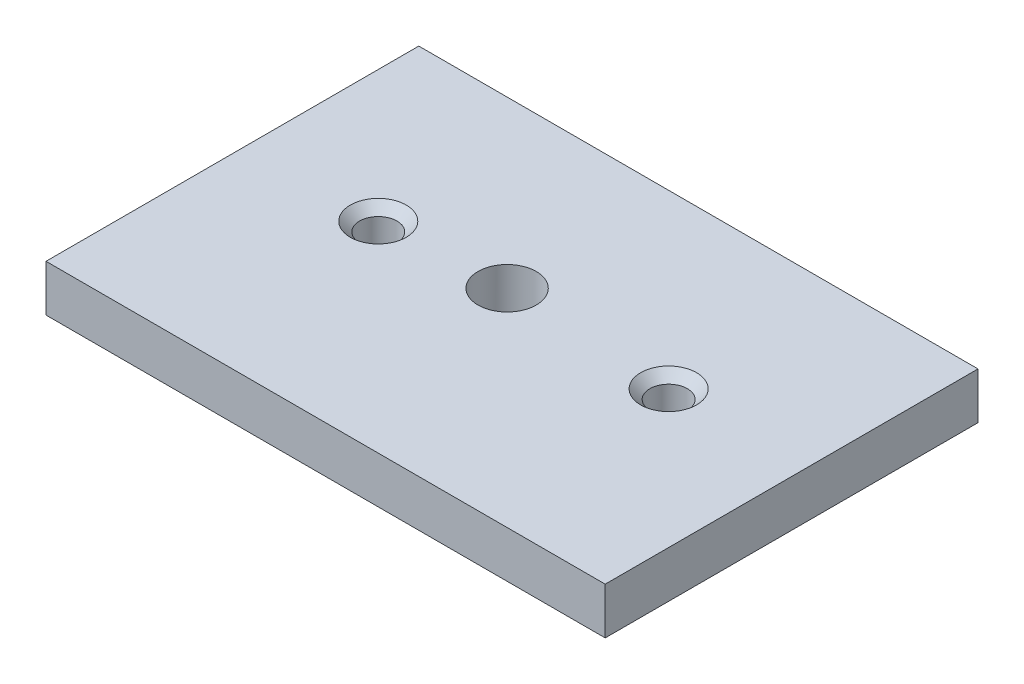
ISO-10303-21;
HEADER;
FILE_DESCRIPTION(('STEP AP214'),'2;1');
FILE_NAME('part.step','',(''),(''),'','','');
FILE_SCHEMA(('AUTOMOTIVE_DESIGN { 1 0 10303 214 1 1 1 1 }'));
ENDSEC;
DATA;
#1=APPLICATION_CONTEXT('core data for automotive mechanical design processes');
#2=APPLICATION_PROTOCOL_DEFINITION('international standard','automotive_design',2000,#1);
#3=PRODUCT_CONTEXT('',#1,'mechanical');
#4=PRODUCT('Part','Part','',(#3));
#5=PRODUCT_RELATED_PRODUCT_CATEGORY('part','',(#4));
#6=PRODUCT_DEFINITION_FORMATION('','',#4);
#7=PRODUCT_DEFINITION_CONTEXT('part definition',#1,'design');
#8=PRODUCT_DEFINITION('design','',#6,#7);
#9=PRODUCT_DEFINITION_SHAPE('','',#8);
#10=(LENGTH_UNIT() NAMED_UNIT(*) SI_UNIT(.MILLI.,.METRE.));
#11=(NAMED_UNIT(*) PLANE_ANGLE_UNIT() SI_UNIT($,.RADIAN.));
#12=(NAMED_UNIT(*) SI_UNIT($,.STERADIAN.) SOLID_ANGLE_UNIT());
#13=UNCERTAINTY_MEASURE_WITH_UNIT(LENGTH_MEASURE(1.E-05),#10,'distance_accuracy_value','');
#14=(GEOMETRIC_REPRESENTATION_CONTEXT(3) GLOBAL_UNCERTAINTY_ASSIGNED_CONTEXT((#13)) GLOBAL_UNIT_ASSIGNED_CONTEXT((#10,
#11,#12)) REPRESENTATION_CONTEXT('',''));
#15=CARTESIAN_POINT('',(0.,0.,0.));
#16=DIRECTION('',(0.,0.,1.));
#17=DIRECTION('',(1.,0.,0.));
#18=AXIS2_PLACEMENT_3D('',#15,#16,#17);
#19=CARTESIAN_POINT('',(0.,6.35,0.));
#20=DIRECTION('',(0.,-1.,0.));
#21=DIRECTION('',(0.,0.,-1.));
#22=AXIS2_PLACEMENT_3D('',#19,#20,#21);
#23=PLANE('',#22);
#24=CARTESIAN_POINT('',(17.9054735563682,6.35,-27.3722801140366));
#25=DIRECTION('',(0.,1.,0.));
#26=DIRECTION('',(0.,0.,1.));
#27=AXIS2_PLACEMENT_3D('',#24,#25,#26);
#28=CIRCLE('',#27,3.81);
#29=CARTESIAN_POINT('',(17.9054735563682,6.35,-23.5622801140366));
#30=VERTEX_POINT('',#29);
#31=EDGE_CURVE('E130',#30,#30,#28,.T.);
#32=ORIENTED_EDGE('',*,*,#31,.F.);
#33=EDGE_LOOP('',(#32));
#34=FACE_BOUND('',#33,.T.);
#35=CARTESIAN_POINT('',(57.4701574421965,6.35,-27.3722801140366));
#36=DIRECTION('',(0.,1.,0.));
#37=DIRECTION('',(0.,0.,1.));
#38=AXIS2_PLACEMENT_3D('',#35,#36,#37);
#39=CIRCLE('',#38,3.81);
#40=CARTESIAN_POINT('',(57.4701574421965,6.35,-23.5622801140366));
#41=VERTEX_POINT('',#40);
#42=EDGE_CURVE('E121',#41,#41,#39,.T.);
#43=ORIENTED_EDGE('',*,*,#42,.F.);
#44=EDGE_LOOP('',(#43));
#45=FACE_BOUND('',#44,.T.);
#46=DIRECTION('',(0.,0.,1.));
#47=VECTOR('',#46,1.);
#48=CARTESIAN_POINT('',(0.,6.35,0.));
#49=LINE('',#48,#47);
#50=CARTESIAN_POINT('',(0.,6.35,-50.8));
#51=VERTEX_POINT('',#50);
#52=CARTESIAN_POINT('',(0.,6.35,0.));
#53=VERTEX_POINT('',#52);
#54=EDGE_CURVE('E90',#51,#53,#49,.T.);
#55=ORIENTED_EDGE('',*,*,#54,.T.);
#56=DIRECTION('',(1.,0.,0.));
#57=VECTOR('',#56,1.);
#58=CARTESIAN_POINT('',(0.,6.35,0.));
#59=LINE('',#58,#57);
#60=CARTESIAN_POINT('',(76.2,6.35,0.));
#61=VERTEX_POINT('',#60);
#62=EDGE_CURVE('E85',#53,#61,#59,.T.);
#63=ORIENTED_EDGE('',*,*,#62,.T.);
#64=DIRECTION('',(0.,0.,-1.));
#65=VECTOR('',#64,1.);
#66=CARTESIAN_POINT('',(76.2,6.35,0.));
#67=LINE('',#66,#65);
#68=CARTESIAN_POINT('',(76.2,6.35,-50.8));
#69=VERTEX_POINT('',#68);
#70=EDGE_CURVE('E88',#61,#69,#67,.T.);
#71=ORIENTED_EDGE('',*,*,#70,.T.);
#72=DIRECTION('',(-1.,0.,0.));
#73=VECTOR('',#72,1.);
#74=CARTESIAN_POINT('',(0.,6.35,-50.8));
#75=LINE('',#74,#73);
#76=EDGE_CURVE('E55',#69,#51,#75,.T.);
#77=ORIENTED_EDGE('',*,*,#76,.T.);
#78=EDGE_LOOP('',(#55,#63,#71,#77));
#79=FACE_BOUND('',#78,.T.);
#80=CARTESIAN_POINT('',(34.5997886868357,6.35,-28.2342967100871));
#81=DIRECTION('',(0.,1.,0.));
#82=DIRECTION('',(0.,0.,1.));
#83=AXIS2_PLACEMENT_3D('',#80,#81,#82);
#84=CIRCLE('',#83,3.96874999999999);
#85=CARTESIAN_POINT('',(34.5997886868357,6.35,-24.2655467100871));
#86=VERTEX_POINT('',#85);
#87=EDGE_CURVE('E136',#86,#86,#84,.T.);
#88=ORIENTED_EDGE('',*,*,#87,.F.);
#89=EDGE_LOOP('',(#88));
#90=FACE_BOUND('',#89,.T.);
#91=ADVANCED_FACE('F38',(#34,#45,#79,#90),#23,.F.);
#92=CARTESIAN_POINT('',(0.,6.35,0.));
#93=DIRECTION('',(1.,0.,0.));
#94=DIRECTION('',(0.,0.,-1.));
#95=AXIS2_PLACEMENT_3D('',#92,#93,#94);
#96=PLANE('',#95);
#97=DIRECTION('',(0.,0.,1.));
#98=VECTOR('',#97,1.);
#99=CARTESIAN_POINT('',(0.,0.,0.));
#100=LINE('',#99,#98);
#101=CARTESIAN_POINT('',(0.,0.,-50.8));
#102=VERTEX_POINT('',#101);
#103=CARTESIAN_POINT('',(0.,0.,0.));
#104=VERTEX_POINT('',#103);
#105=EDGE_CURVE('E102',#102,#104,#100,.T.);
#106=ORIENTED_EDGE('',*,*,#105,.T.);
#107=DIRECTION('',(0.,-1.,0.));
#108=VECTOR('',#107,1.);
#109=CARTESIAN_POINT('',(0.,6.35,0.));
#110=LINE('',#109,#108);
#111=EDGE_CURVE('E11',#53,#104,#110,.T.);
#112=ORIENTED_EDGE('',*,*,#111,.F.);
#113=ORIENTED_EDGE('',*,*,#54,.F.);
#114=DIRECTION('',(0.,-1.,0.));
#115=VECTOR('',#114,1.);
#116=CARTESIAN_POINT('',(0.,6.35,-50.8));
#117=LINE('',#116,#115);
#118=EDGE_CURVE('E98',#51,#102,#117,.T.);
#119=ORIENTED_EDGE('',*,*,#118,.T.);
#120=EDGE_LOOP('',(#106,#112,#113,#119));
#121=FACE_BOUND('',#120,.T.);
#122=ADVANCED_FACE('F40',(#121),#96,.F.);
#123=CARTESIAN_POINT('',(0.,6.35,0.));
#124=DIRECTION('',(0.,0.,-1.));
#125=DIRECTION('',(-1.,0.,0.));
#126=AXIS2_PLACEMENT_3D('',#123,#124,#125);
#127=PLANE('',#126);
#128=DIRECTION('',(1.,0.,0.));
#129=VECTOR('',#128,1.);
#130=CARTESIAN_POINT('',(0.,0.,0.));
#131=LINE('',#130,#129);
#132=CARTESIAN_POINT('',(76.2,0.,0.));
#133=VERTEX_POINT('',#132);
#134=EDGE_CURVE('E94',#104,#133,#131,.T.);
#135=ORIENTED_EDGE('',*,*,#134,.T.);
#136=DIRECTION('',(0.,-1.,0.));
#137=VECTOR('',#136,1.);
#138=CARTESIAN_POINT('',(76.2,6.35,0.));
#139=LINE('',#138,#137);
#140=EDGE_CURVE('E47',#61,#133,#139,.T.);
#141=ORIENTED_EDGE('',*,*,#140,.F.);
#142=ORIENTED_EDGE('',*,*,#62,.F.);
#143=ORIENTED_EDGE('',*,*,#111,.T.);
#144=EDGE_LOOP('',(#135,#141,#142,#143));
#145=FACE_BOUND('',#144,.T.);
#146=ADVANCED_FACE('F93',(#145),#127,.F.);
#147=CARTESIAN_POINT('',(76.2,6.35,0.));
#148=DIRECTION('',(-1.,0.,0.));
#149=DIRECTION('',(0.,0.,1.));
#150=AXIS2_PLACEMENT_3D('',#147,#148,#149);
#151=PLANE('',#150);
#152=DIRECTION('',(0.,0.,-1.));
#153=VECTOR('',#152,1.);
#154=CARTESIAN_POINT('',(76.2,0.,0.));
#155=LINE('',#154,#153);
#156=CARTESIAN_POINT('',(76.2,0.,-50.8));
#157=VERTEX_POINT('',#156);
#158=EDGE_CURVE('E72',#133,#157,#155,.T.);
#159=ORIENTED_EDGE('',*,*,#158,.T.);
#160=DIRECTION('',(0.,-1.,0.));
#161=VECTOR('',#160,1.);
#162=CARTESIAN_POINT('',(76.2,6.35,-50.8));
#163=LINE('',#162,#161);
#164=EDGE_CURVE('E95',#69,#157,#163,.T.);
#165=ORIENTED_EDGE('',*,*,#164,.F.);
#166=ORIENTED_EDGE('',*,*,#70,.F.);
#167=ORIENTED_EDGE('',*,*,#140,.T.);
#168=EDGE_LOOP('',(#159,#165,#166,#167));
#169=FACE_BOUND('',#168,.T.);
#170=ADVANCED_FACE('F96',(#169),#151,.F.);
#171=CARTESIAN_POINT('',(0.,6.35,-50.8));
#172=DIRECTION('',(0.,0.,1.));
#173=DIRECTION('',(1.,0.,0.));
#174=AXIS2_PLACEMENT_3D('',#171,#172,#173);
#175=PLANE('',#174);
#176=DIRECTION('',(-1.,0.,0.));
#177=VECTOR('',#176,1.);
#178=CARTESIAN_POINT('',(0.,0.,-50.8));
#179=LINE('',#178,#177);
#180=EDGE_CURVE('E78',#157,#102,#179,.T.);
#181=ORIENTED_EDGE('',*,*,#180,.T.);
#182=ORIENTED_EDGE('',*,*,#118,.F.);
#183=ORIENTED_EDGE('',*,*,#76,.F.);
#184=ORIENTED_EDGE('',*,*,#164,.T.);
#185=EDGE_LOOP('',(#181,#182,#183,#184));
#186=FACE_BOUND('',#185,.T.);
#187=ADVANCED_FACE('F110',(#186),#175,.F.);
#188=CARTESIAN_POINT('',(0.,0.,0.));
#189=DIRECTION('',(0.,-1.,0.));
#190=DIRECTION('',(0.,0.,-1.));
#191=AXIS2_PLACEMENT_3D('',#188,#189,#190);
#192=PLANE('',#191);
#193=CARTESIAN_POINT('',(34.5997886868357,0.,-28.2342967100871));
#194=DIRECTION('',(0.,-1.,0.));
#195=DIRECTION('',(0.,0.,-1.));
#196=AXIS2_PLACEMENT_3D('',#193,#194,#195);
#197=CIRCLE('',#196,3.96874999999999);
#198=CARTESIAN_POINT('',(34.5997886868357,0.,-32.2030467100871));
#199=VERTEX_POINT('',#198);
#200=EDGE_CURVE('E133',#199,#199,#197,.T.);
#201=ORIENTED_EDGE('',*,*,#200,.F.);
#202=EDGE_LOOP('',(#201));
#203=FACE_BOUND('',#202,.T.);
#204=CARTESIAN_POINT('',(17.9054735563682,0.,-27.3722801140366));
#205=DIRECTION('',(0.,1.,0.));
#206=DIRECTION('',(0.,0.,1.));
#207=AXIS2_PLACEMENT_3D('',#204,#205,#206);
#208=CIRCLE('',#207,2.5527);
#209=CARTESIAN_POINT('',(17.9054735563682,0.,-24.8195801140366));
#210=VERTEX_POINT('',#209);
#211=EDGE_CURVE('E124',#210,#210,#208,.T.);
#212=ORIENTED_EDGE('',*,*,#211,.T.);
#213=EDGE_LOOP('',(#212));
#214=FACE_BOUND('',#213,.T.);
#215=CARTESIAN_POINT('',(57.4701574421965,0.,-27.3722801140366));
#216=DIRECTION('',(0.,1.,0.));
#217=DIRECTION('',(0.,0.,1.));
#218=AXIS2_PLACEMENT_3D('',#215,#216,#217);
#219=CIRCLE('',#218,2.5527);
#220=CARTESIAN_POINT('',(57.4701574421965,0.,-24.8195801140366));
#221=VERTEX_POINT('',#220);
#222=EDGE_CURVE('E105',#221,#221,#219,.T.);
#223=ORIENTED_EDGE('',*,*,#222,.T.);
#224=EDGE_LOOP('',(#223));
#225=FACE_BOUND('',#224,.T.);
#226=ORIENTED_EDGE('',*,*,#105,.F.);
#227=ORIENTED_EDGE('',*,*,#180,.F.);
#228=ORIENTED_EDGE('',*,*,#158,.F.);
#229=ORIENTED_EDGE('',*,*,#134,.F.);
#230=EDGE_LOOP('',(#226,#227,#228,#229));
#231=FACE_BOUND('',#230,.T.);
#232=ADVANCED_FACE('F113',(#203,#214,#225,#231),#192,.T.);
#233=CARTESIAN_POINT('',(57.4701574421965,6.35,-27.3722801140366));
#234=DIRECTION('',(0.,1.,0.));
#235=DIRECTION('',(0.,0.,1.));
#236=AXIS2_PLACEMENT_3D('',#233,#234,#235);
#237=CYLINDRICAL_SURFACE('',#236,2.5527);
#238=ORIENTED_EDGE('',*,*,#222,.F.);
#239=EDGE_LOOP('',(#238));
#240=FACE_BOUND('',#239,.T.);
#241=CARTESIAN_POINT('',(57.4701574421965,5.0927,-27.3722801140366));
#242=DIRECTION('',(0.,1.,0.));
#243=DIRECTION('',(0.,0.,1.));
#244=AXIS2_PLACEMENT_3D('',#241,#242,#243);
#245=CIRCLE('',#244,2.5527);
#246=CARTESIAN_POINT('',(57.4701574421965,5.0927,-24.8195801140366));
#247=VERTEX_POINT('',#246);
#248=EDGE_CURVE('E118',#247,#247,#245,.T.);
#249=ORIENTED_EDGE('',*,*,#248,.T.);
#250=EDGE_LOOP('',(#249));
#251=FACE_BOUND('',#250,.T.);
#252=ADVANCED_FACE('F152',(#240,#251),#237,.F.);
#253=CARTESIAN_POINT('',(57.4701574421965,6.35,-27.3722801140366));
#254=DIRECTION('',(0.,1.,0.));
#255=DIRECTION('',(0.,0.,1.));
#256=AXIS2_PLACEMENT_3D('',#253,#254,#255);
#257=CONICAL_SURFACE('',#256,3.81,0.78539816339745);
#258=ORIENTED_EDGE('',*,*,#248,.F.);
#259=EDGE_LOOP('',(#258));
#260=FACE_BOUND('',#259,.T.);
#261=ORIENTED_EDGE('',*,*,#42,.T.);
#262=EDGE_LOOP('',(#261));
#263=FACE_BOUND('',#262,.T.);
#264=ADVANCED_FACE('F186',(#260,#263),#257,.F.);
#265=CARTESIAN_POINT('',(17.9054735563682,6.35,-27.3722801140366));
#266=DIRECTION('',(0.,1.,0.));
#267=DIRECTION('',(0.,0.,1.));
#268=AXIS2_PLACEMENT_3D('',#265,#266,#267);
#269=CYLINDRICAL_SURFACE('',#268,2.5527);
#270=ORIENTED_EDGE('',*,*,#211,.F.);
#271=EDGE_LOOP('',(#270));
#272=FACE_BOUND('',#271,.T.);
#273=CARTESIAN_POINT('',(17.9054735563682,5.0927,-27.3722801140366));
#274=DIRECTION('',(0.,1.,0.));
#275=DIRECTION('',(0.,0.,1.));
#276=AXIS2_PLACEMENT_3D('',#273,#274,#275);
#277=CIRCLE('',#276,2.5527);
#278=CARTESIAN_POINT('',(17.9054735563682,5.0927,-24.8195801140366));
#279=VERTEX_POINT('',#278);
#280=EDGE_CURVE('E127',#279,#279,#277,.T.);
#281=ORIENTED_EDGE('',*,*,#280,.T.);
#282=EDGE_LOOP('',(#281));
#283=FACE_BOUND('',#282,.T.);
#284=ADVANCED_FACE('F195',(#272,#283),#269,.F.);
#285=CARTESIAN_POINT('',(17.9054735563682,6.35,-27.3722801140366));
#286=DIRECTION('',(0.,1.,0.));
#287=DIRECTION('',(0.,0.,1.));
#288=AXIS2_PLACEMENT_3D('',#285,#286,#287);
#289=CONICAL_SURFACE('',#288,3.81,0.78539816339745);
#290=ORIENTED_EDGE('',*,*,#280,.F.);
#291=EDGE_LOOP('',(#290));
#292=FACE_BOUND('',#291,.T.);
#293=ORIENTED_EDGE('',*,*,#31,.T.);
#294=EDGE_LOOP('',(#293));
#295=FACE_BOUND('',#294,.T.);
#296=ADVANCED_FACE('F202',(#292,#295),#289,.F.);
#297=CARTESIAN_POINT('',(34.5997886868357,6.35,-28.2342967100871));
#298=DIRECTION('',(0.,1.,0.));
#299=DIRECTION('',(0.,0.,1.));
#300=AXIS2_PLACEMENT_3D('',#297,#298,#299);
#301=CYLINDRICAL_SURFACE('',#300,3.96874999999999);
#302=ORIENTED_EDGE('',*,*,#87,.T.);
#303=EDGE_LOOP('',(#302));
#304=FACE_BOUND('',#303,.T.);
#305=ORIENTED_EDGE('',*,*,#200,.T.);
#306=EDGE_LOOP('',(#305));
#307=FACE_BOUND('',#306,.T.);
#308=ADVANCED_FACE('F140',(#304,#307),#301,.F.);
#309=CLOSED_SHELL('',(#91,#122,#146,#170,#187,#232,#252,#264,#284,#296,#308));
#310=MANIFOLD_SOLID_BREP('B2',#309);
#311=ADVANCED_BREP_SHAPE_REPRESENTATION('',(#18,#310),#14);
#312=SHAPE_DEFINITION_REPRESENTATION(#9,#311);
ENDSEC;
END-ISO-10303-21;
